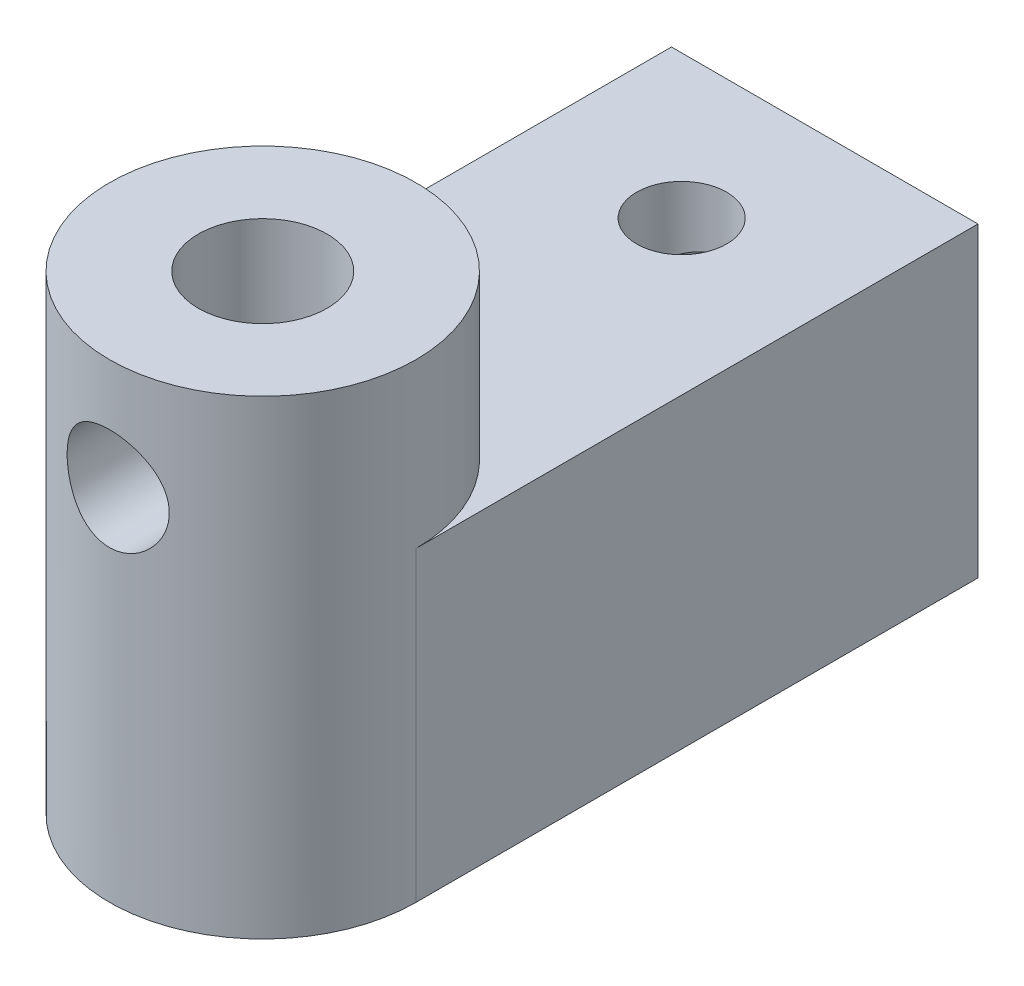
ISO-10303-21;
HEADER;
FILE_DESCRIPTION(('STEP AP214'),'2;1');
FILE_NAME('part.step','',(''),(''),'','','');
FILE_SCHEMA(('AUTOMOTIVE_DESIGN { 1 0 10303 214 1 1 1 1 }'));
ENDSEC;
DATA;
#1=APPLICATION_CONTEXT('core data for automotive mechanical design processes');
#2=APPLICATION_PROTOCOL_DEFINITION('international standard','automotive_design',2000,#1);
#3=PRODUCT_CONTEXT('',#1,'mechanical');
#4=PRODUCT('Part','Part','',(#3));
#5=PRODUCT_RELATED_PRODUCT_CATEGORY('part','',(#4));
#6=PRODUCT_DEFINITION_FORMATION('','',#4);
#7=PRODUCT_DEFINITION_CONTEXT('part definition',#1,'design');
#8=PRODUCT_DEFINITION('design','',#6,#7);
#9=PRODUCT_DEFINITION_SHAPE('','',#8);
#10=(LENGTH_UNIT() NAMED_UNIT(*) SI_UNIT(.MILLI.,.METRE.));
#11=(NAMED_UNIT(*) PLANE_ANGLE_UNIT() SI_UNIT($,.RADIAN.));
#12=(NAMED_UNIT(*) SI_UNIT($,.STERADIAN.) SOLID_ANGLE_UNIT());
#13=UNCERTAINTY_MEASURE_WITH_UNIT(LENGTH_MEASURE(1.E-05),#10,'distance_accuracy_value','');
#14=(GEOMETRIC_REPRESENTATION_CONTEXT(3) GLOBAL_UNCERTAINTY_ASSIGNED_CONTEXT((#13)) GLOBAL_UNIT_ASSIGNED_CONTEXT((#10,
#11,#12)) REPRESENTATION_CONTEXT('',''));
#15=CARTESIAN_POINT('',(0.,0.,0.));
#16=DIRECTION('',(0.,0.,1.));
#17=DIRECTION('',(1.,0.,0.));
#18=AXIS2_PLACEMENT_3D('',#15,#16,#17);
#19=CARTESIAN_POINT('',(0.,13.,0.));
#20=DIRECTION('',(0.,-1.,0.));
#21=DIRECTION('',(0.,0.,-1.));
#22=AXIS2_PLACEMENT_3D('',#19,#20,#21);
#23=CYLINDRICAL_SURFACE('',#22,7.5);
#24=CARTESIAN_POINT('',(0.,13.,0.));
#25=DIRECTION('',(0.,1.,0.));
#26=DIRECTION('',(0.,0.,1.));
#27=AXIS2_PLACEMENT_3D('',#24,#25,#26);
#28=CIRCLE('',#27,7.5);
#29=CARTESIAN_POINT('',(0.,13.,7.5));
#30=VERTEX_POINT('',#29);
#31=EDGE_CURVE('E11',#30,#30,#28,.T.);
#32=ORIENTED_EDGE('',*,*,#31,.F.);
#33=EDGE_LOOP('',(#32));
#34=FACE_BOUND('',#33,.T.);
#35=DIRECTION('',(0.,-1.,0.));
#36=VECTOR('',#35,1.);
#37=CARTESIAN_POINT('',(7.5,5.,0.));
#38=LINE('',#37,#36);
#39=CARTESIAN_POINT('',(7.5,5.,0.));
#40=VERTEX_POINT('',#39);
#41=CARTESIAN_POINT('',(7.5,-10.,0.));
#42=VERTEX_POINT('',#41);
#43=EDGE_CURVE('E101',#40,#42,#38,.T.);
#44=ORIENTED_EDGE('',*,*,#43,.F.);
#45=CARTESIAN_POINT('',(0.,5.,0.));
#46=DIRECTION('',(0.,-1.,0.));
#47=DIRECTION('',(0.,0.,1.));
#48=AXIS2_PLACEMENT_3D('',#45,#46,#47);
#49=CIRCLE('',#48,7.5);
#50=CARTESIAN_POINT('',(-7.5,5.,0.));
#51=VERTEX_POINT('',#50);
#52=EDGE_CURVE('E122',#51,#40,#49,.T.);
#53=ORIENTED_EDGE('',*,*,#52,.F.);
#54=DIRECTION('',(0.,-1.,0.));
#55=VECTOR('',#54,1.);
#56=CARTESIAN_POINT('',(-7.5,5.,0.));
#57=LINE('',#56,#55);
#58=CARTESIAN_POINT('',(-7.5,-10.,0.));
#59=VERTEX_POINT('',#58);
#60=EDGE_CURVE('E133',#51,#59,#57,.T.);
#61=ORIENTED_EDGE('',*,*,#60,.T.);
#62=CARTESIAN_POINT('',(0.,-10.,0.));
#63=DIRECTION('',(0.,-1.,0.));
#64=DIRECTION('',(0.,0.,-1.));
#65=AXIS2_PLACEMENT_3D('',#62,#63,#64);
#66=CIRCLE('',#65,7.5);
#67=EDGE_CURVE('E141',#42,#59,#66,.T.);
#68=ORIENTED_EDGE('',*,*,#67,.F.);
#69=EDGE_LOOP('',(#44,#53,#61,#68));
#70=FACE_BOUND('',#69,.T.);
#71=CARTESIAN_POINT('',(-2.5,7.53727981258729,7.07106781186547));
#72=CARTESIAN_POINT('',(-2.50000064486928,7.67345024967747,7.07106736326085));
#73=CARTESIAN_POINT('',(-2.48883695921381,7.80961681214627,7.07504423227143));
#74=CARTESIAN_POINT('',(-2.44462782922202,8.07791586507291,7.09043935203137));
#75=CARTESIAN_POINT('',(-2.41157878042099,8.21004768726846,7.10185882855472));
#76=CARTESIAN_POINT('',(-2.32488871421226,8.46634704508051,7.13070509221979));
#77=CARTESIAN_POINT('',(-2.27128805350812,8.59052963619408,7.14812009928304));
#78=CARTESIAN_POINT('',(-2.14515407110345,8.82817993395719,7.18697805025812));
#79=CARTESIAN_POINT('',(-2.07261657215046,8.94164526897136,7.20842188259031));
#80=CARTESIAN_POINT('',(-1.9076278661072,9.15907971843307,7.25386223518683));
#81=CARTESIAN_POINT('',(-1.8145608534448,9.26256838426661,7.2779223711161));
#82=CARTESIAN_POINT('',(-1.61246916803599,9.45279681564888,7.32534662002507));
#83=CARTESIAN_POINT('',(-1.50344193763094,9.53953389154321,7.34871062072404));
#84=CARTESIAN_POINT('',(-1.26901126991252,9.69597705591127,7.39284667304497));
#85=CARTESIAN_POINT('',(-1.14325477806131,9.76517973913218,7.41353519254014));
#86=CARTESIAN_POINT('',(-0.881078057468685,9.88125877540606,7.44923966927457));
#87=CARTESIAN_POINT('',(-0.74466071421803,9.92814114552955,7.46425715507505));
#88=CARTESIAN_POINT('',(-0.470072043583737,9.99661944916827,7.48647688579767));
#89=CARTESIAN_POINT('',(-0.332126887132422,10.0190384282298,7.49393286943898));
#90=CARTESIAN_POINT('',(-0.0542446870602243,10.0405705459889,7.5010902054562));
#91=CARTESIAN_POINT('',(0.0856918338597405,10.0396896917183,7.50079355657239));
#92=CARTESIAN_POINT('',(0.357758787984536,10.0151691761722,7.49265099046828));
#93=CARTESIAN_POINT('',(0.489980121479141,9.99242349140107,7.48510161887793));
#94=CARTESIAN_POINT('',(0.748608597055429,9.92629736013611,7.46367418349329));
#95=CARTESIAN_POINT('',(0.87501534444804,9.88291551513773,7.44979569077954));
#96=CARTESIAN_POINT('',(1.12038118710493,9.77622651932214,7.41689175733061));
#97=CARTESIAN_POINT('',(1.23922055242211,9.71266496622101,7.39780106310039));
#98=CARTESIAN_POINT('',(1.46481081381831,9.56763054896565,7.35645982597298));
#99=CARTESIAN_POINT('',(1.57155833596335,9.48615270426821,7.33420840503667));
#100=CARTESIAN_POINT('',(1.77525216637827,9.30309382893804,7.28765479624741));
#101=CARTESIAN_POINT('',(1.87150039266318,9.20074691798358,7.26330537922194));
#102=CARTESIAN_POINT('',(2.04569314899543,8.98115799827074,7.21618338122252));
#103=CARTESIAN_POINT('',(2.12363485820386,8.86391369826718,7.19341104364038));
#104=CARTESIAN_POINT('',(2.25996863758936,8.61564574857869,7.15176312802781));
#105=CARTESIAN_POINT('',(2.31806615905335,8.48444948429285,7.1329477321187));
#106=CARTESIAN_POINT('',(2.41110798317334,8.21335132705124,7.10204127060962));
#107=CARTESIAN_POINT('',(2.44606198936873,8.07345310957167,7.08994738717732));
#108=CARTESIAN_POINT('',(2.4904032052438,7.79568392405835,7.07449090788963));
#109=CARTESIAN_POINT('',(2.50087273876908,7.65800625071565,7.0707590079689));
#110=CARTESIAN_POINT('',(2.4990135972743,7.38283943980202,7.07141680147961));
#111=CARTESIAN_POINT('',(2.48668906306691,7.24535027252732,7.07580501979536));
#112=CARTESIAN_POINT('',(2.44056412888078,6.97938739830751,7.09184045225748));
#113=CARTESIAN_POINT('',(2.40751598495171,6.85076623721018,7.10323313602101));
#114=CARTESIAN_POINT('',(2.32178465640117,6.60092079698933,7.13171384177557));
#115=CARTESIAN_POINT('',(2.26909799090856,6.47969783361034,7.14880287337099));
#116=CARTESIAN_POINT('',(2.14368585184734,6.24382876046979,7.18742193989467));
#117=CARTESIAN_POINT('',(2.07037779589624,6.12951320598278,7.20907564164071));
#118=CARTESIAN_POINT('',(1.9064640763939,5.91441468162799,7.25414421827413));
#119=CARTESIAN_POINT('',(1.81585331374696,5.81363571593424,7.27755961109486));
#120=CARTESIAN_POINT('',(1.61472926475081,5.62345985236069,7.32487596594623));
#121=CARTESIAN_POINT('',(1.50346817636663,5.53484383754016,7.34874608944741));
#122=CARTESIAN_POINT('',(1.26706822850064,5.37748945671718,7.39317129032772));
#123=CARTESIAN_POINT('',(1.14192986216138,5.30875038468123,7.41372648544237));
#124=CARTESIAN_POINT('',(0.881949656080739,5.193729550433,7.44911014526507));
#125=CARTESIAN_POINT('',(0.747177808302991,5.14730161971712,7.46397575011328));
#126=CARTESIAN_POINT('',(0.471146164615041,5.07796045743702,7.48646527094436));
#127=CARTESIAN_POINT('',(0.329888729884724,5.05503873788603,7.49409180085047));
#128=CARTESIAN_POINT('',(0.052038339650103,5.03412461857318,7.50104658090641));
#129=CARTESIAN_POINT('',(-0.0844618098000455,5.03501117775634,7.50074800223598));
#130=CARTESIAN_POINT('',(-0.355277862500434,5.05892308295331,7.49280491298495));
#131=CARTESIAN_POINT('',(-0.489593942047642,5.08194663296921,7.48516099833939));
#132=CARTESIAN_POINT('',(-0.750105298580148,5.14873539902719,7.46352287386031));
#133=CARTESIAN_POINT('',(-0.876395677281973,5.19216535096962,7.44963145902871));
#134=CARTESIAN_POINT('',(-1.11994587734949,5.29822364033017,7.41692901761237));
#135=CARTESIAN_POINT('',(-1.23720406035608,5.36085545057982,7.39811710120041));
#136=CARTESIAN_POINT('',(-1.46408504077196,5.50620359284231,7.35664672069702));
#137=CARTESIAN_POINT('',(-1.57326562889402,5.58957652604139,7.33387181229816));
#138=CARTESIAN_POINT('',(-1.77645256568107,5.77292329047777,7.28732471979699));
#139=CARTESIAN_POINT('',(-1.87045405406148,5.8729024182441,7.26355221932743));
#140=CARTESIAN_POINT('',(-2.0443545220828,6.09130320155466,7.21658199563995));
#141=CARTESIAN_POINT('',(-2.12355741499475,6.21029359002889,7.19344319971577));
#142=CARTESIAN_POINT('',(-2.26078585825279,6.46061587984424,7.15150483307538));
#143=CARTESIAN_POINT('',(-2.31881694204869,6.59194454516145,7.13270412903123));
#144=CARTESIAN_POINT('',(-2.40960957051041,6.85718437262637,7.10253335516286));
#145=CARTESIAN_POINT('',(-2.4433947728738,6.9907104714007,7.09086582142956));
#146=CARTESIAN_POINT('',(-2.48858580037317,7.26191993875404,7.07513458848796));
#147=CARTESIAN_POINT('',(-2.49999934799148,7.39960185611406,7.07106826543653));
#148=CARTESIAN_POINT('',(-2.5,7.53727981258729,7.07106781186547));
#149=B_SPLINE_CURVE_WITH_KNOTS('',3,(#71,#72,#73,#74,#75,#76,#77,#78,#79,#80,#81,#82,#83,#84,
#85,#86,#87,#88,#89,#90,#91,#92,#93,#94,#95,#96,#97,#98,#99,#100,#101,#102,#103,#104,#105,#106,
#107,#108,#109,#110,#111,#112,#113,#114,#115,#116,#117,#118,#119,#120,#121,#122,#123,#124,#125,
#126,#127,#128,#129,#130,#131,#132,#133,#134,#135,#136,#137,#138,#139,#140,#141,#142,#143,#144,
#145,#146,#147,#148),.UNSPECIFIED.,.T.,.F.,(4,2,2,2,2,2,2,2,2,2,2,2,2,2,2,2,2,2,2,2,2,2,2,2,2,2,
2,2,2,2,2,2,2,2,2,2,2,2,4),(0.,0.40800146199839,0.816070137537909,1.22334156875207,
1.63070291546361,2.0525334356892,2.4744316292997,2.90733765359143,3.34012690966973,
3.75785796912336,4.17548133255818,4.57672512063923,4.97799610473092,5.38454137150837,
5.79119979685055,6.21700435909794,6.64287449030265,7.07481599607639,7.50657628391539,
7.91885728411099,8.33106339593084,8.7291098942194,9.12722697867364,9.53797144339287,
9.94883714155318,10.3794702042773,10.8100879689383,11.2378447797713,11.6654470751039,
12.0729521169409,12.4804241002445,12.8814239010107,13.2824962690811,13.6983879880158,
14.1144126108158,14.5467225684036,14.9789194566717,15.3915803040673,15.8040986797616),.UNSPECIFIED.);
#150=CARTESIAN_POINT('',(-2.5,7.53727981258729,7.07106781186547));
#151=VERTEX_POINT('',#150);
#152=EDGE_CURVE('E226',#151,#151,#149,.T.);
#153=ORIENTED_EDGE('',*,*,#152,.T.);
#154=EDGE_LOOP('',(#153));
#155=FACE_BOUND('',#154,.T.);
#156=ADVANCED_FACE('F41',(#34,#70,#155),#23,.T.);
#157=CARTESIAN_POINT('',(0.,13.,0.));
#158=DIRECTION('',(0.,-1.,0.));
#159=DIRECTION('',(0.,0.,-1.));
#160=AXIS2_PLACEMENT_3D('',#157,#158,#159);
#161=CYLINDRICAL_SURFACE('',#160,3.15);
#162=CARTESIAN_POINT('',(0.,0.,0.));
#163=DIRECTION('',(0.,1.,0.));
#164=DIRECTION('',(0.,0.,1.));
#165=AXIS2_PLACEMENT_3D('',#162,#163,#164);
#166=CIRCLE('',#165,3.15);
#167=CARTESIAN_POINT('',(0.,0.,3.15));
#168=VERTEX_POINT('',#167);
#169=EDGE_CURVE('E144',#168,#168,#166,.T.);
#170=ORIENTED_EDGE('',*,*,#169,.F.);
#171=EDGE_LOOP('',(#170));
#172=FACE_BOUND('',#171,.T.);
#173=CARTESIAN_POINT('',(0.,13.,0.));
#174=DIRECTION('',(0.,1.,0.));
#175=DIRECTION('',(0.,0.,1.));
#176=AXIS2_PLACEMENT_3D('',#173,#174,#175);
#177=CIRCLE('',#176,3.15);
#178=CARTESIAN_POINT('',(0.,13.,3.15));
#179=VERTEX_POINT('',#178);
#180=EDGE_CURVE('E56',#179,#179,#177,.T.);
#181=ORIENTED_EDGE('',*,*,#180,.T.);
#182=EDGE_LOOP('',(#181));
#183=FACE_BOUND('',#182,.T.);
#184=CARTESIAN_POINT('',(-2.5,7.53727981258729,1.91637678967368));
#185=CARTESIAN_POINT('',(-2.50000481336088,7.442287640456,1.91636569342069));
#186=CARTESIAN_POINT('',(-2.49453921957506,7.34731714379724,1.9235616215752));
#187=CARTESIAN_POINT('',(-2.47322197837662,7.16036611713374,1.95088654713941));
#188=CARTESIAN_POINT('',(-2.45734724615938,7.06839271092106,1.97104428860632));
#189=CARTESIAN_POINT('',(-2.40932266513046,6.85876775801117,2.02965938227219));
#190=CARTESIAN_POINT('',(-2.37346257465234,6.7430982213983,2.0720182406521));
#191=CARTESIAN_POINT('',(-2.28742245175883,6.52144727582231,2.16663139824787));
#192=CARTESIAN_POINT('',(-2.23720050060087,6.41549544388409,2.21891451148909));
#193=CARTESIAN_POINT('',(-2.14226026198435,6.24623005598039,2.30998834790925));
#194=CARTESIAN_POINT('',(-2.10107540722968,6.1802670914825,2.34762852829518));
#195=CARTESIAN_POINT('',(-2.01297084710013,6.05270434705216,2.42360018390345));
#196=CARTESIAN_POINT('',(-1.96604916991019,5.99110607887405,2.46193189293177));
#197=CARTESIAN_POINT('',(-1.81690499330267,5.81309733553499,2.57623361434105));
#198=CARTESIAN_POINT('',(-1.70615905469512,5.70321660048563,2.65165645168917));
#199=CARTESIAN_POINT('',(-1.48646556014856,5.52321459327068,2.77953805583491));
#200=CARTESIAN_POINT('',(-1.38136459616789,5.44951741782039,2.83360901303536));
#201=CARTESIAN_POINT('',(-1.15770702148479,5.3177094479159,2.93207529450144));
#202=CARTESIAN_POINT('',(-1.03917160979643,5.25957457105576,2.97648554835642));
#203=CARTESIAN_POINT('',(-0.810526647030403,5.16965736169178,3.0458928476986));
#204=CARTESIAN_POINT('',(-0.702091704583694,5.13514997789383,3.07285702024744));
#205=CARTESIAN_POINT('',(-0.479393455575093,5.08100529550272,3.11536508706588));
#206=CARTESIAN_POINT('',(-0.365133327585331,5.06135997803432,3.13091513972536));
#207=CARTESIAN_POINT('',(-0.133565580289274,5.03813185745013,3.14931570850617));
#208=CARTESIAN_POINT('',(-0.0162491023761022,5.03460260094305,3.15212388877292));
#209=CARTESIAN_POINT('',(0.217300092404373,5.04400080948005,3.14466723845068));
#210=CARTESIAN_POINT('',(0.33353274276203,5.05692927785306,3.13440161082991));
#211=CARTESIAN_POINT('',(0.555382886611707,5.09727837410615,3.10257383915971));
#212=CARTESIAN_POINT('',(0.661237716835977,5.12390666910299,3.08162982494591));
#213=CARTESIAN_POINT('',(0.86650226796032,5.18976957746575,3.03032653493511));
#214=CARTESIAN_POINT('',(0.965910377156102,5.22900732875275,2.99996491558934));
#215=CARTESIAN_POINT('',(1.16614638981006,5.32289356309255,2.92830913854913));
#216=CARTESIAN_POINT('',(1.26615830131932,5.37867563636916,2.88623507031245));
#217=CARTESIAN_POINT('',(1.45560803094847,5.50160359116661,2.79548896865547));
#218=CARTESIAN_POINT('',(1.54503950808539,5.56875622918621,2.74681301577417));
#219=CARTESIAN_POINT('',(1.73015816515951,5.72776136921023,2.63496006914718));
#220=CARTESIAN_POINT('',(1.82335880043798,5.82185425866888,2.57085787571947));
#221=CARTESIAN_POINT('',(1.99358153640545,6.02300467957661,2.44122417117006));
#222=CARTESIAN_POINT('',(2.07058508733398,6.13007685684984,2.37569111509931));
#223=CARTESIAN_POINT('',(2.19997020092368,6.34398673797316,2.25599002669514));
#224=CARTESIAN_POINT('',(2.25415085249706,6.44948352492968,2.20137456814705));
#225=CARTESIAN_POINT('',(2.34803882002893,6.67063233254133,2.10093298527824));
#226=CARTESIAN_POINT('',(2.38777788251836,6.78626137615538,2.05508768821311));
#227=CARTESIAN_POINT('',(2.44153330005093,6.99251830981696,1.99064254123793));
#228=CARTESIAN_POINT('',(2.45966019877266,7.08077733104336,1.96799904188137));
#229=CARTESIAN_POINT('',(2.48632400162942,7.26081542644467,1.93421061739557));
#230=CARTESIAN_POINT('',(2.49488124534641,7.35258660447757,1.92304130886766));
#231=CARTESIAN_POINT('',(2.50172069323035,7.53766576149312,1.91414114430065));
#232=CARTESIAN_POINT('',(2.49995114882464,7.63097913970663,1.91647796828561));
#233=CARTESIAN_POINT('',(2.48618851820122,7.81561718352639,1.93428963975207));
#234=CARTESIAN_POINT('',(2.47418044032107,7.90693873141837,1.94978375251709));
#235=CARTESIAN_POINT('',(2.4363715517725,8.10947622050155,1.99692648270543));
#236=CARTESIAN_POINT('',(2.40771418243299,8.2193743030446,2.03181572083994));
#237=CARTESIAN_POINT('',(2.33749397068425,8.43093909733902,2.11221606918778));
#238=CARTESIAN_POINT('',(2.29589334574266,8.53258059750301,2.1577581782233));
#239=CARTESIAN_POINT('',(2.21463902795812,8.69976792766019,2.24058833353436));
#240=CARTESIAN_POINT('',(2.17778098762955,8.76737366988017,2.27655277872926));
#241=CARTESIAN_POINT('',(2.09839677743203,8.89838330906729,2.34992576596565));
#242=CARTESIAN_POINT('',(2.05586843085438,8.9617855783468,2.38733485863905));
#243=CARTESIAN_POINT('',(1.96526721891577,9.0843843984617,2.46245566108453));
#244=CARTESIAN_POINT('',(1.91719113661606,9.14357847663965,2.50016753451744));
#245=CARTESIAN_POINT('',(1.81560002900031,9.25758153408302,2.57489602484883));
#246=CARTESIAN_POINT('',(1.76208222013565,9.31238824324624,2.61191227433586));
#247=CARTESIAN_POINT('',(1.59212413256682,9.4710024601982,2.7213683837043));
#248=CARTESIAN_POINT('',(1.46717337648401,9.56778276415919,2.79143684282292));
#249=CARTESIAN_POINT('',(1.26438648964982,9.69544970609493,2.88607187202518));
#250=CARTESIAN_POINT('',(1.19429439906125,9.73506280674952,2.91585215789373));
#251=CARTESIAN_POINT('',(1.04926863296856,9.80787738925495,2.97111861937727));
#252=CARTESIAN_POINT('',(0.974337763030501,9.84108254272431,2.99660725294453));
#253=CARTESIAN_POINT('',(0.793016180884583,9.91079379916751,3.05047853335277));
#254=CARTESIAN_POINT('',(0.684822182808709,9.94436047647999,3.07673139329912));
#255=CARTESIAN_POINT('',(0.462868555604543,9.99669747806423,3.11784736489806));
#256=CARTESIAN_POINT('',(0.349113191282559,10.0154789572325,3.13271906298861));
#257=CARTESIAN_POINT('',(0.118751445190665,10.037142816564,3.14988411937067));
#258=CARTESIAN_POINT('',(0.00213706223962179,10.0399738041262,3.15213681902217));
#259=CARTESIAN_POINT('',(-0.229883432371584,10.0293962871322,3.14374529489746));
#260=CARTESIAN_POINT('',(-0.345289392250281,10.0159857666991,3.13309947017136));
#261=CARTESIAN_POINT('',(-0.566188335257463,9.97479545689383,3.10061805504065));
#262=CARTESIAN_POINT('',(-0.671893061753026,9.94770622410331,3.07932065130099));
#263=CARTESIAN_POINT('',(-0.876788673240281,9.88096581980565,3.02736297326131));
#264=CARTESIAN_POINT('',(-0.975977893216798,9.8413114522831,2.99670031692631));
#265=CARTESIAN_POINT('',(-1.17594711080402,9.74648782978298,2.92439103625877));
#266=CARTESIAN_POINT('',(-1.27588499432623,9.69015978542062,2.88195018387879));
#267=CARTESIAN_POINT('',(-1.46511263234463,9.56613776003459,2.79052123818953));
#268=CARTESIAN_POINT('',(-1.55439564293534,9.4984366451059,2.74152903942305));
#269=CARTESIAN_POINT('',(-1.7392036644905,9.33813473128859,2.62900249201611));
#270=CARTESIAN_POINT('',(-1.83221304128772,9.24327881403734,2.56455384021115));
#271=CARTESIAN_POINT('',(-2.00191618466813,9.04055691854435,2.43439135419204));
#272=CARTESIAN_POINT('',(-2.07859390546887,8.93267830707165,2.36867634426298));
#273=CARTESIAN_POINT('',(-2.20641644286463,8.71849950892331,2.24963746618314));
#274=CARTESIAN_POINT('',(-2.25955358413295,8.6136828530248,2.19579074564119));
#275=CARTESIAN_POINT('',(-2.3516149935329,8.39404113553677,2.09689191023709));
#276=CARTESIAN_POINT('',(-2.39056048246121,8.27923133785242,2.05182671169326));
#277=CARTESIAN_POINT('',(-2.44671954590184,8.06070786211788,1.98435694262435));
#278=CARTESIAN_POINT('',(-2.46652191587716,7.95849267693926,1.95938531824126));
#279=CARTESIAN_POINT('',(-2.49313769557465,7.74992582555105,1.92542822113524));
#280=CARTESIAN_POINT('',(-2.49999461318072,7.64358924510992,1.91638920792175));
#281=CARTESIAN_POINT('',(-2.5,7.53727981258729,1.91637678967368));
#282=B_SPLINE_CURVE_WITH_KNOTS('',3,(#184,#185,#186,#187,#188,#189,#190,#191,#192,#193,#194,
#195,#196,#197,#198,#199,#200,#201,#202,#203,#204,#205,#206,#207,#208,#209,#210,#211,#212,#213,
#214,#215,#216,#217,#218,#219,#220,#221,#222,#223,#224,#225,#226,#227,#228,#229,#230,#231,#232,
#233,#234,#235,#236,#237,#238,#239,#240,#241,#242,#243,#244,#245,#246,#247,#248,#249,#250,#251,
#252,#253,#254,#255,#256,#257,#258,#259,#260,#261,#262,#263,#264,#265,#266,#267,#268,#269,#270,
#271,#272,#273,#274,#275,#276,#277,#278,#279,#280,#281),.UNSPECIFIED.,.T.,.F.,(4,2,2,2,2,2,2,2,
2,2,2,2,2,2,2,2,2,2,2,2,2,2,2,2,2,2,2,2,2,2,2,2,2,2,2,2,2,2,2,2,2,2,2,2,2,2,2,2,4),(0.,
0.284555358092769,0.569743931316466,0.952515666943966,1.33641622611963,1.59530285322924,
1.85427871427495,2.37125643221051,2.78759647832011,3.20328847082891,3.55263569607782,
3.90179429522037,4.25211215530301,4.60245137319035,4.93448930258713,5.26660992521644,
5.63128602191698,5.99617957802575,6.43600343950848,6.87632830057697,7.26689263501761,
7.65659313402081,7.93426190412943,8.21133938180857,8.48980651088391,8.76868208405721,
9.1231564217772,9.47867536717756,9.73333782068504,9.9880983166229,10.2430072887493,
10.4980473140458,11.0131758450179,11.2703193278177,11.5273150324947,11.8746080200272,
12.2216387357888,12.5697869504235,12.917978381238,13.2501263731972,13.582358916847,
13.947983571297,14.3138384307821,14.7552110042159,15.1970152441381,15.5836770078552,
15.9697581998839,16.2892909936524,16.6077479565936),.UNSPECIFIED.);
#283=CARTESIAN_POINT('',(-2.5,7.53727981258729,1.91637678967368));
#284=VERTEX_POINT('',#283);
#285=EDGE_CURVE('E46',#284,#284,#282,.T.);
#286=ORIENTED_EDGE('',*,*,#285,.T.);
#287=EDGE_LOOP('',(#286));
#288=FACE_BOUND('',#287,.T.);
#289=ADVANCED_FACE('F43',(#172,#183,#288),#161,.F.);
#290=CARTESIAN_POINT('',(0.,13.,0.));
#291=DIRECTION('',(0.,1.,0.));
#292=DIRECTION('',(0.,0.,1.));
#293=AXIS2_PLACEMENT_3D('',#290,#291,#292);
#294=PLANE('',#293);
#295=ORIENTED_EDGE('',*,*,#180,.F.);
#296=EDGE_LOOP('',(#295));
#297=FACE_BOUND('',#296,.T.);
#298=ORIENTED_EDGE('',*,*,#31,.T.);
#299=EDGE_LOOP('',(#298));
#300=FACE_BOUND('',#299,.T.);
#301=ADVANCED_FACE('F192',(#297,#300),#294,.T.);
#302=CARTESIAN_POINT('',(0.,0.,0.));
#303=DIRECTION('',(0.,-1.,0.));
#304=DIRECTION('',(0.,0.,-1.));
#305=AXIS2_PLACEMENT_3D('',#302,#303,#304);
#306=PLANE('',#305);
#307=ORIENTED_EDGE('',*,*,#169,.T.);
#308=EDGE_LOOP('',(#307));
#309=FACE_BOUND('',#308,.T.);
#310=ADVANCED_FACE('F199',(#309),#306,.F.);
#311=CARTESIAN_POINT('',(0.,-10.,0.));
#312=DIRECTION('',(0.,-1.,0.));
#313=DIRECTION('',(0.,0.,-1.));
#314=AXIS2_PLACEMENT_3D('',#311,#312,#313);
#315=PLANE('',#314);
#316=CARTESIAN_POINT('',(0.,-10.,-20.5));
#317=DIRECTION('',(0.,-1.,0.));
#318=DIRECTION('',(0.,0.,-1.));
#319=AXIS2_PLACEMENT_3D('',#316,#317,#318);
#320=CIRCLE('',#319,2.2);
#321=CARTESIAN_POINT('',(0.,-10.,-22.7));
#322=VERTEX_POINT('',#321);
#323=EDGE_CURVE('E160',#322,#322,#320,.T.);
#324=ORIENTED_EDGE('',*,*,#323,.F.);
#325=EDGE_LOOP('',(#324));
#326=FACE_BOUND('',#325,.T.);
#327=ORIENTED_EDGE('',*,*,#67,.T.);
#328=DIRECTION('',(0.,0.,1.));
#329=VECTOR('',#328,1.);
#330=CARTESIAN_POINT('',(-7.5,-10.,0.));
#331=LINE('',#330,#329);
#332=CARTESIAN_POINT('',(-7.5,-10.,-27.5));
#333=VERTEX_POINT('',#332);
#334=EDGE_CURVE('E106',#333,#59,#331,.T.);
#335=ORIENTED_EDGE('',*,*,#334,.F.);
#336=DIRECTION('',(-1.,0.,0.));
#337=VECTOR('',#336,1.);
#338=CARTESIAN_POINT('',(-7.5,-10.,-27.5));
#339=LINE('',#338,#337);
#340=CARTESIAN_POINT('',(7.5,-10.,-27.5));
#341=VERTEX_POINT('',#340);
#342=EDGE_CURVE('E97',#341,#333,#339,.T.);
#343=ORIENTED_EDGE('',*,*,#342,.F.);
#344=DIRECTION('',(0.,0.,-1.));
#345=VECTOR('',#344,1.);
#346=CARTESIAN_POINT('',(7.5,-10.,0.));
#347=LINE('',#346,#345);
#348=EDGE_CURVE('E64',#42,#341,#347,.T.);
#349=ORIENTED_EDGE('',*,*,#348,.F.);
#350=EDGE_LOOP('',(#327,#335,#343,#349));
#351=FACE_BOUND('',#350,.T.);
#352=ADVANCED_FACE('F105',(#326,#351),#315,.T.);
#353=CARTESIAN_POINT('',(7.5,5.,0.));
#354=DIRECTION('',(-1.,0.,0.));
#355=DIRECTION('',(0.,0.,1.));
#356=AXIS2_PLACEMENT_3D('',#353,#354,#355);
#357=PLANE('',#356);
#358=ORIENTED_EDGE('',*,*,#43,.T.);
#359=ORIENTED_EDGE('',*,*,#348,.T.);
#360=DIRECTION('',(0.,-1.,0.));
#361=VECTOR('',#360,1.);
#362=CARTESIAN_POINT('',(7.5,5.,-27.5));
#363=LINE('',#362,#361);
#364=CARTESIAN_POINT('',(7.5,5.,-27.5));
#365=VERTEX_POINT('',#364);
#366=EDGE_CURVE('E94',#365,#341,#363,.T.);
#367=ORIENTED_EDGE('',*,*,#366,.F.);
#368=DIRECTION('',(0.,0.,-1.));
#369=VECTOR('',#368,1.);
#370=CARTESIAN_POINT('',(7.5,5.,0.));
#371=LINE('',#370,#369);
#372=EDGE_CURVE('E126',#40,#365,#371,.T.);
#373=ORIENTED_EDGE('',*,*,#372,.F.);
#374=EDGE_LOOP('',(#358,#359,#367,#373));
#375=FACE_BOUND('',#374,.T.);
#376=ADVANCED_FACE('F109',(#375),#357,.F.);
#377=CARTESIAN_POINT('',(-7.5,5.,-27.5));
#378=DIRECTION('',(0.,0.,1.));
#379=DIRECTION('',(1.,0.,0.));
#380=AXIS2_PLACEMENT_3D('',#377,#378,#379);
#381=PLANE('',#380);
#382=CARTESIAN_POINT('',(0.,-2.5,-27.5));
#383=DIRECTION('',(0.,0.,-1.));
#384=DIRECTION('',(-1.,0.,0.));
#385=AXIS2_PLACEMENT_3D('',#382,#383,#384);
#386=CIRCLE('',#385,4.7);
#387=CARTESIAN_POINT('',(-4.7,-2.5,-27.5));
#388=VERTEX_POINT('',#387);
#389=EDGE_CURVE('E117',#388,#388,#386,.T.);
#390=ORIENTED_EDGE('',*,*,#389,.F.);
#391=EDGE_LOOP('',(#390));
#392=FACE_BOUND('',#391,.T.);
#393=ORIENTED_EDGE('',*,*,#366,.T.);
#394=ORIENTED_EDGE('',*,*,#342,.T.);
#395=DIRECTION('',(0.,-1.,0.));
#396=VECTOR('',#395,1.);
#397=CARTESIAN_POINT('',(-7.5,5.,-27.5));
#398=LINE('',#397,#396);
#399=CARTESIAN_POINT('',(-7.5,5.,-27.5));
#400=VERTEX_POINT('',#399);
#401=EDGE_CURVE('E102',#400,#333,#398,.T.);
#402=ORIENTED_EDGE('',*,*,#401,.F.);
#403=DIRECTION('',(-1.,0.,0.));
#404=VECTOR('',#403,1.);
#405=CARTESIAN_POINT('',(-7.5,5.,-27.5));
#406=LINE('',#405,#404);
#407=EDGE_CURVE('E98',#365,#400,#406,.T.);
#408=ORIENTED_EDGE('',*,*,#407,.F.);
#409=EDGE_LOOP('',(#393,#394,#402,#408));
#410=FACE_BOUND('',#409,.T.);
#411=ADVANCED_FACE('F95',(#392,#410),#381,.F.);
#412=CARTESIAN_POINT('',(-7.5,5.,0.));
#413=DIRECTION('',(1.,0.,0.));
#414=DIRECTION('',(0.,0.,-1.));
#415=AXIS2_PLACEMENT_3D('',#412,#413,#414);
#416=PLANE('',#415);
#417=ORIENTED_EDGE('',*,*,#401,.T.);
#418=ORIENTED_EDGE('',*,*,#334,.T.);
#419=ORIENTED_EDGE('',*,*,#60,.F.);
#420=DIRECTION('',(0.,0.,1.));
#421=VECTOR('',#420,1.);
#422=CARTESIAN_POINT('',(-7.5,5.,0.));
#423=LINE('',#422,#421);
#424=EDGE_CURVE('E72',#400,#51,#423,.T.);
#425=ORIENTED_EDGE('',*,*,#424,.F.);
#426=EDGE_LOOP('',(#417,#418,#419,#425));
#427=FACE_BOUND('',#426,.T.);
#428=ADVANCED_FACE('F211',(#427),#416,.F.);
#429=CARTESIAN_POINT('',(0.,5.,0.));
#430=DIRECTION('',(0.,1.,0.));
#431=DIRECTION('',(0.,0.,1.));
#432=AXIS2_PLACEMENT_3D('',#429,#430,#431);
#433=PLANE('',#432);
#434=CARTESIAN_POINT('',(0.,5.,-20.5));
#435=DIRECTION('',(0.,1.,0.));
#436=DIRECTION('',(0.,0.,1.));
#437=AXIS2_PLACEMENT_3D('',#434,#435,#436);
#438=CIRCLE('',#437,2.2);
#439=CARTESIAN_POINT('',(0.,5.,-18.3));
#440=VERTEX_POINT('',#439);
#441=EDGE_CURVE('E221',#440,#440,#438,.T.);
#442=ORIENTED_EDGE('',*,*,#441,.F.);
#443=EDGE_LOOP('',(#442));
#444=FACE_BOUND('',#443,.T.);
#445=ORIENTED_EDGE('',*,*,#52,.T.);
#446=ORIENTED_EDGE('',*,*,#372,.T.);
#447=ORIENTED_EDGE('',*,*,#407,.T.);
#448=ORIENTED_EDGE('',*,*,#424,.T.);
#449=EDGE_LOOP('',(#445,#446,#447,#448));
#450=FACE_BOUND('',#449,.T.);
#451=ADVANCED_FACE('F185',(#444,#450),#433,.T.);
#452=CARTESIAN_POINT('',(0.,-2.5,-7.5000000000001));
#453=DIRECTION('',(0.,0.,-1.));
#454=DIRECTION('',(-1.,0.,0.));
#455=AXIS2_PLACEMENT_3D('',#452,#453,#454);
#456=CYLINDRICAL_SURFACE('',#455,4.7);
#457=CARTESIAN_POINT('',(0.,2.2,-22.7));
#458=CARTESIAN_POINT('',(-0.11652470877591,2.1999946049169,-22.6999935851695));
#459=CARTESIAN_POINT('',(-0.233213919695943,2.19561892054238,-22.6906877217298));
#460=CARTESIAN_POINT('',(-0.463197921185049,2.17854828521208,-22.653850314947));
#461=CARTESIAN_POINT('',(-0.576484659495455,2.16583501108969,-22.6262786282206));
#462=CARTESIAN_POINT('',(-0.795976745019553,2.13343108100349,-22.5541938206452));
#463=CARTESIAN_POINT('',(-0.90220667097529,2.11376633441756,-22.5097435642152));
#464=CARTESIAN_POINT('',(-1.1055693877353,2.06930696887016,-22.4054620873301));
#465=CARTESIAN_POINT('',(-1.20270366531018,2.04451319043171,-22.3456333866373));
#466=CARTESIAN_POINT('',(-1.39112927957095,1.99053292390581,-22.2085288959317));
#467=CARTESIAN_POINT('',(-1.48180607367589,1.96117990355349,-22.1304749255867));
#468=CARTESIAN_POINT('',(-1.64933488240709,1.90199990585091,-21.9607960636997));
#469=CARTESIAN_POINT('',(-1.72617773764136,1.87217262861446,-21.8691622536589));
#470=CARTESIAN_POINT('',(-1.86889412525886,1.8131876488483,-21.6676702247743));
#471=CARTESIAN_POINT('',(-1.93371492896799,1.78420276336269,-21.5570100951857));
#472=CARTESIAN_POINT('',(-2.04355442437833,1.73291696426895,-21.3248316951457));
#473=CARTESIAN_POINT('',(-2.08858582507517,1.71061176382674,-21.2033204539258));
#474=CARTESIAN_POINT('',(-2.15487489853755,1.6770603565513,-20.9599056367874));
#475=CARTESIAN_POINT('',(-2.17732326655879,1.66526452782312,-20.8384055283004));
#476=CARTESIAN_POINT('',(-2.20149283498856,1.65254585202791,-20.5928363888368));
#477=CARTESIAN_POINT('',(-2.20323035651612,1.65161444330044,-20.4687694578895));
#478=CARTESIAN_POINT('',(-2.18681015237596,1.66027773501195,-20.2350952809864));
#479=CARTESIAN_POINT('',(-2.17065506052397,1.6688130138989,-20.1252991862799));
#480=CARTESIAN_POINT('',(-2.12233352604083,1.69361779446057,-19.9102066467026));
#481=CARTESIAN_POINT('',(-2.09016293221371,1.7098893013057,-19.8049113761268));
#482=CARTESIAN_POINT('',(-2.01009467986403,1.74870915695972,-19.5988761419052));
#483=CARTESIAN_POINT('',(-1.96185105880324,1.7713937537335,-19.4982974826009));
#484=CARTESIAN_POINT('',(-1.85126047978407,1.82047335359177,-19.3062115917784));
#485=CARTESIAN_POINT('',(-1.7889073470647,1.84686997925518,-19.2147083572411));
#486=CARTESIAN_POINT('',(-1.64389832982097,1.90389615741209,-19.0328400693198));
#487=CARTESIAN_POINT('',(-1.55976816570255,1.93467300106277,-18.9436928464996));
#488=CARTESIAN_POINT('',(-1.37754377303631,1.99461580472123,-18.7803037075986));
#489=CARTESIAN_POINT('',(-1.27944439555932,2.02378116522402,-18.706067311947));
#490=CARTESIAN_POINT('',(-1.06753093244193,2.07851088034709,-18.5721420477154));
#491=CARTESIAN_POINT('',(-0.953277957384744,2.10390760481786,-18.5130737830722));
#492=CARTESIAN_POINT('',(-0.714963002342457,2.14687464111823,-18.4154434231234));
#493=CARTESIAN_POINT('',(-0.590907950617723,2.16445042366018,-18.3768669902059));
#494=CARTESIAN_POINT('',(-0.346570037381193,2.18868950938429,-18.3241528235107));
#495=CARTESIAN_POINT('',(-0.226710230373995,2.19607691018752,-18.3083889802279));
#496=CARTESIAN_POINT('',(0.0141640414106511,2.20151981099424,-18.2967476397543));
#497=CARTESIAN_POINT('',(0.135178035713988,2.19957896371107,-18.3008623586091));
#498=CARTESIAN_POINT('',(0.366470211187337,2.18702892727429,-18.3278209164029));
#499=CARTESIAN_POINT('',(0.476930038738203,2.17699992837692,-18.3494115187206));
#500=CARTESIAN_POINT('',(0.692477545310978,2.14997631823843,-18.4088334313478));
#501=CARTESIAN_POINT('',(0.797564595454064,2.13298089367322,-18.4466666379916));
#502=CARTESIAN_POINT('',(1.0030598592457,2.0929478975334,-18.5386399206538));
#503=CARTESIAN_POINT('',(1.10322662967466,2.06974140795236,-18.5932433995414));
#504=CARTESIAN_POINT('',(1.2933301675869,2.01962136021313,-18.7167002961753));
#505=CARTESIAN_POINT('',(1.38326241377209,1.99270617518582,-18.7855599742929));
#506=CARTESIAN_POINT('',(1.55873448219749,1.93504354751446,-18.9426281329717));
#507=CARTESIAN_POINT('',(1.64318590443534,1.90416754208085,-19.0320079934284));
#508=CARTESIAN_POINT('',(1.79631042345624,1.84396740471692,-19.2239320550342));
#509=CARTESIAN_POINT('',(1.86497585359181,1.81464403213902,-19.3264826151597));
#510=CARTESIAN_POINT('',(1.98661974806271,1.76004062087729,-19.5462592418761));
#511=CARTESIAN_POINT('',(2.03900484168108,1.73492621866499,-19.6638582837818));
#512=CARTESIAN_POINT('',(2.12269640492955,1.69361117809459,-19.9077710278621));
#513=CARTESIAN_POINT('',(2.15402636765298,1.6774006086374,-20.0340748431963));
#514=CARTESIAN_POINT('',(2.19212172860951,1.65752594814418,-20.2795329940983));
#515=CARTESIAN_POINT('',(2.2008527098675,1.65285963231231,-20.398300653997));
#516=CARTESIAN_POINT('',(2.19901648101808,1.65383351839827,-20.6356273537307));
#517=CARTESIAN_POINT('',(2.18845478963042,1.65947077295298,-20.7541864435174));
#518=CARTESIAN_POINT('',(2.1501071716079,1.67940726804931,-20.9785841899979));
#519=CARTESIAN_POINT('',(2.12364939467787,1.69303681514404,-21.0847160225258));
#520=CARTESIAN_POINT('',(2.05575915419007,1.72673421371828,-21.2909816863121));
#521=CARTESIAN_POINT('',(2.0143222195879,1.74680398730361,-21.3911137163094));
#522=CARTESIAN_POINT('',(1.91452870775634,1.79275931293951,-21.5898410799478));
#523=CARTESIAN_POINT('',(1.85523204861938,1.81894235580486,-21.6878937929639));
#524=CARTESIAN_POINT('',(1.72254403513758,1.8735554607962,-21.8732618651513));
#525=CARTESIAN_POINT('',(1.64914606029878,1.90198657467571,-21.9605721490975));
#526=CARTESIAN_POINT('',(1.48158750191749,1.96134114941712,-22.131132695765));
#527=CARTESIAN_POINT('',(1.38607739166704,1.99222563171037,-22.2130777112074));
#528=CARTESIAN_POINT('',(1.18165719980014,2.05027065364359,-22.3599796715604));
#529=CARTESIAN_POINT('',(1.0727407556582,2.07742941205929,-22.4249285041718));
#530=CARTESIAN_POINT('',(0.84470269644074,2.12492957633664,-22.5353001474432));
#531=CARTESIAN_POINT('',(0.725633707343783,2.14530373837362,-22.5808170855014));
#532=CARTESIAN_POINT('',(0.480490166901105,2.17699564310342,-22.6506443239704));
#533=CARTESIAN_POINT('',(0.354437626803823,2.18834028249196,-22.6750176256507));
#534=CARTESIAN_POINT('',(0.189479635863532,2.19633297664795,-22.6921556641757));
#535=CARTESIAN_POINT('',(0.151662104845859,2.19770532394648,-22.695094054599));
#536=CARTESIAN_POINT('',(0.0759022034377201,2.19953972370353,-22.6990172873648));
#537=CARTESIAN_POINT('',(0.0379598305088379,2.2000017575366,-22.700002089736));
#538=CARTESIAN_POINT('',(0.,2.2,-22.7));
#539=B_SPLINE_CURVE_WITH_KNOTS('',3,(#457,#458,#459,#460,#461,#462,#463,#464,#465,#466,#467,
#468,#469,#470,#471,#472,#473,#474,#475,#476,#477,#478,#479,#480,#481,#482,#483,#484,#485,#486,
#487,#488,#489,#490,#491,#492,#493,#494,#495,#496,#497,#498,#499,#500,#501,#502,#503,#504,#505,
#506,#507,#508,#509,#510,#511,#512,#513,#514,#515,#516,#517,#518,#519,#520,#521,#522,#523,#524,
#525,#526,#527,#528,#529,#530,#531,#532,#533,#534,#535,#536,#537,#538),.UNSPECIFIED.,.T.,.F.,(4,
2,2,2,2,2,2,2,2,2,2,2,2,2,2,2,2,2,2,2,2,2,2,2,2,2,2,2,2,2,2,2,2,2,2,2,2,2,2,2,4),(0.,
0.349419028123845,0.699608544506507,1.04850636999725,1.3973470648867,1.76536026810323,
2.13361624229435,2.52607279985826,2.91827694739696,3.28850541280667,3.65844210150362,
3.99080813252181,4.32326035724497,4.66338835071168,5.00366548363094,5.38113949239129,
5.75875299663341,6.14997354280904,6.54092000020204,6.90233145174262,7.26360139494893,
7.60104268758972,7.9385233874319,8.2863270933474,8.63428385664127,9.01295416756174,
9.39180799736268,9.78318131802381,10.1741172201882,10.5296922472502,10.8851655770682,
11.2144148632036,11.5437625063596,11.89495897362,12.2463207305107,12.6332433706134,
13.0203503539136,13.4055603221598,13.7896185061798,13.9034451430046,14.0172741087534),.UNSPECIFIED.);
#540=CARTESIAN_POINT('',(0.,2.2,-22.7));
#541=VERTEX_POINT('',#540);
#542=EDGE_CURVE('E159',#541,#541,#539,.T.);
#543=ORIENTED_EDGE('',*,*,#542,.T.);
#544=EDGE_LOOP('',(#543));
#545=FACE_BOUND('',#544,.T.);
#546=CARTESIAN_POINT('',(0.,-7.2,-22.7));
#547=CARTESIAN_POINT('',(0.11652470877591,-7.19999460491691,-22.6999935851695));
#548=CARTESIAN_POINT('',(0.233213919695943,-7.19561892054238,-22.6906877217298));
#549=CARTESIAN_POINT('',(0.463197921185049,-7.17854828521208,-22.653850314947));
#550=CARTESIAN_POINT('',(0.576484659495455,-7.16583501108969,-22.6262786282206));
#551=CARTESIAN_POINT('',(0.795976745019553,-7.13343108100349,-22.5541938206452));
#552=CARTESIAN_POINT('',(0.90220667097529,-7.11376633441756,-22.5097435642152));
#553=CARTESIAN_POINT('',(1.1055693877353,-7.06930696887016,-22.4054620873301));
#554=CARTESIAN_POINT('',(1.20270366531018,-7.04451319043171,-22.3456333866373));
#555=CARTESIAN_POINT('',(1.39112927957095,-6.99053292390581,-22.2085288959317));
#556=CARTESIAN_POINT('',(1.48180607367589,-6.96117990355349,-22.1304749255867));
#557=CARTESIAN_POINT('',(1.64933488240709,-6.90199990585091,-21.9607960636997));
#558=CARTESIAN_POINT('',(1.72617773764136,-6.87217262861446,-21.8691622536589));
#559=CARTESIAN_POINT('',(1.86889412525886,-6.8131876488483,-21.6676702247743));
#560=CARTESIAN_POINT('',(1.93371492896799,-6.78420276336269,-21.5570100951857));
#561=CARTESIAN_POINT('',(2.04355442437833,-6.73291696426895,-21.3248316951457));
#562=CARTESIAN_POINT('',(2.08858582507517,-6.71061176382674,-21.2033204539258));
#563=CARTESIAN_POINT('',(2.15487489853755,-6.6770603565513,-20.9599056367874));
#564=CARTESIAN_POINT('',(2.17732326655879,-6.66526452782312,-20.8384055283004));
#565=CARTESIAN_POINT('',(2.20149283498856,-6.65254585202791,-20.5928363888368));
#566=CARTESIAN_POINT('',(2.20323035651612,-6.65161444330044,-20.4687694578895));
#567=CARTESIAN_POINT('',(2.18681015237596,-6.66027773501195,-20.2350952809864));
#568=CARTESIAN_POINT('',(2.17065506052397,-6.6688130138989,-20.1252991862799));
#569=CARTESIAN_POINT('',(2.12233352604083,-6.69361779446058,-19.9102066467026));
#570=CARTESIAN_POINT('',(2.09016293221371,-6.7098893013057,-19.8049113761268));
#571=CARTESIAN_POINT('',(2.01009467986403,-6.74870915695972,-19.5988761419052));
#572=CARTESIAN_POINT('',(1.96185105880324,-6.7713937537335,-19.4982974826009));
#573=CARTESIAN_POINT('',(1.85126047978407,-6.82047335359177,-19.3062115917784));
#574=CARTESIAN_POINT('',(1.7889073470647,-6.84686997925518,-19.2147083572411));
#575=CARTESIAN_POINT('',(1.64389832982097,-6.90389615741209,-19.0328400693198));
#576=CARTESIAN_POINT('',(1.55976816570255,-6.93467300106277,-18.9436928464996));
#577=CARTESIAN_POINT('',(1.37754377303631,-6.99461580472123,-18.7803037075986));
#578=CARTESIAN_POINT('',(1.27944439555932,-7.02378116522402,-18.706067311947));
#579=CARTESIAN_POINT('',(1.06753093244193,-7.07851088034709,-18.5721420477154));
#580=CARTESIAN_POINT('',(0.953277957384744,-7.10390760481786,-18.5130737830722));
#581=CARTESIAN_POINT('',(0.714963002342457,-7.14687464111823,-18.4154434231234));
#582=CARTESIAN_POINT('',(0.590907950617723,-7.16445042366018,-18.3768669902059));
#583=CARTESIAN_POINT('',(0.346570037381193,-7.1886895093843,-18.3241528235107));
#584=CARTESIAN_POINT('',(0.226710230373996,-7.19607691018752,-18.3083889802279));
#585=CARTESIAN_POINT('',(-0.0141640414106512,-7.20151981099424,-18.2967476397543));
#586=CARTESIAN_POINT('',(-0.135178035713988,-7.19957896371108,-18.3008623586091));
#587=CARTESIAN_POINT('',(-0.366470211187337,-7.18702892727429,-18.3278209164029));
#588=CARTESIAN_POINT('',(-0.476930038738203,-7.17699992837692,-18.3494115187206));
#589=CARTESIAN_POINT('',(-0.692477545310977,-7.14997631823843,-18.4088334313478));
#590=CARTESIAN_POINT('',(-0.797564595454064,-7.13298089367322,-18.4466666379916));
#591=CARTESIAN_POINT('',(-1.0030598592457,-7.0929478975334,-18.5386399206538));
#592=CARTESIAN_POINT('',(-1.10322662967466,-7.06974140795236,-18.5932433995415));
#593=CARTESIAN_POINT('',(-1.2933301675869,-7.01962136021313,-18.7167002961753));
#594=CARTESIAN_POINT('',(-1.38326241377209,-6.99270617518582,-18.7855599742929));
#595=CARTESIAN_POINT('',(-1.55873448219749,-6.93504354751446,-18.9426281329717));
#596=CARTESIAN_POINT('',(-1.64318590443534,-6.90416754208085,-19.0320079934284));
#597=CARTESIAN_POINT('',(-1.79631042345624,-6.84396740471692,-19.2239320550342));
#598=CARTESIAN_POINT('',(-1.86497585359181,-6.81464403213902,-19.3264826151597));
#599=CARTESIAN_POINT('',(-1.98661974806271,-6.76004062087729,-19.5462592418761));
#600=CARTESIAN_POINT('',(-2.03900484168108,-6.73492621866499,-19.6638582837818));
#601=CARTESIAN_POINT('',(-2.12269640492955,-6.69361117809459,-19.9077710278621));
#602=CARTESIAN_POINT('',(-2.15402636765298,-6.6774006086374,-20.0340748431963));
#603=CARTESIAN_POINT('',(-2.19212172860951,-6.65752594814418,-20.2795329940983));
#604=CARTESIAN_POINT('',(-2.2008527098675,-6.65285963231231,-20.398300653997));
#605=CARTESIAN_POINT('',(-2.19901648101808,-6.65383351839827,-20.6356273537307));
#606=CARTESIAN_POINT('',(-2.18845478963042,-6.65947077295298,-20.7541864435174));
#607=CARTESIAN_POINT('',(-2.1501071716079,-6.67940726804931,-20.9785841899979));
#608=CARTESIAN_POINT('',(-2.12364939467787,-6.69303681514404,-21.0847160225258));
#609=CARTESIAN_POINT('',(-2.05575915419007,-6.72673421371828,-21.2909816863121));
#610=CARTESIAN_POINT('',(-2.0143222195879,-6.74680398730361,-21.3911137163094));
#611=CARTESIAN_POINT('',(-1.91452870775634,-6.79275931293951,-21.5898410799478));
#612=CARTESIAN_POINT('',(-1.85523204861938,-6.81894235580486,-21.6878937929639));
#613=CARTESIAN_POINT('',(-1.72254403513758,-6.8735554607962,-21.8732618651513));
#614=CARTESIAN_POINT('',(-1.64914606029878,-6.90198657467571,-21.9605721490975));
#615=CARTESIAN_POINT('',(-1.48158750191749,-6.96134114941713,-22.131132695765));
#616=CARTESIAN_POINT('',(-1.38607739166704,-6.99222563171037,-22.2130777112074));
#617=CARTESIAN_POINT('',(-1.18165719980014,-7.05027065364359,-22.3599796715604));
#618=CARTESIAN_POINT('',(-1.0727407556582,-7.07742941205929,-22.4249285041718));
#619=CARTESIAN_POINT('',(-0.844702696440739,-7.12492957633664,-22.5353001474432));
#620=CARTESIAN_POINT('',(-0.72563370734378,-7.14530373837362,-22.5808170855014));
#621=CARTESIAN_POINT('',(-0.480490166901103,-7.17699564310342,-22.6506443239704));
#622=CARTESIAN_POINT('',(-0.354437626803821,-7.18834028249196,-22.6750176256507));
#623=CARTESIAN_POINT('',(-0.189479635863532,-7.19633297664795,-22.6921556641757));
#624=CARTESIAN_POINT('',(-0.15166210484586,-7.19770532394648,-22.695094054599));
#625=CARTESIAN_POINT('',(-0.0759022034377206,-7.19953972370353,-22.6990172873648));
#626=CARTESIAN_POINT('',(-0.0379598305088381,-7.2000017575366,-22.700002089736));
#627=CARTESIAN_POINT('',(0.,-7.2,-22.7));
#628=B_SPLINE_CURVE_WITH_KNOTS('',3,(#546,#547,#548,#549,#550,#551,#552,#553,#554,#555,#556,
#557,#558,#559,#560,#561,#562,#563,#564,#565,#566,#567,#568,#569,#570,#571,#572,#573,#574,#575,
#576,#577,#578,#579,#580,#581,#582,#583,#584,#585,#586,#587,#588,#589,#590,#591,#592,#593,#594,
#595,#596,#597,#598,#599,#600,#601,#602,#603,#604,#605,#606,#607,#608,#609,#610,#611,#612,#613,
#614,#615,#616,#617,#618,#619,#620,#621,#622,#623,#624,#625,#626,#627),.UNSPECIFIED.,.T.,.F.,(4,
2,2,2,2,2,2,2,2,2,2,2,2,2,2,2,2,2,2,2,2,2,2,2,2,2,2,2,2,2,2,2,2,2,2,2,2,2,2,2,4),(0.,
0.349419028123845,0.699608544506507,1.04850636999725,1.3973470648867,1.76536026810323,
2.13361624229435,2.52607279985826,2.91827694739696,3.28850541280667,3.65844210150362,
3.99080813252181,4.32326035724497,4.66338835071168,5.00366548363094,5.38113949239129,
5.75875299663341,6.14997354280904,6.54092000020204,6.90233145174262,7.26360139494893,
7.60104268758972,7.9385233874319,8.2863270933474,8.63428385664127,9.01295416756174,
9.39180799736268,9.78318131802381,10.1741172201882,10.5296922472502,10.8851655770682,
11.2144148632036,11.5437625063596,11.89495897362,12.2463207305107,12.6332433706134,
13.0203503539136,13.4055603221598,13.7896185061798,13.9034451430046,14.0172741087534),.UNSPECIFIED.);
#629=CARTESIAN_POINT('',(0.,-7.2,-22.7));
#630=VERTEX_POINT('',#629);
#631=EDGE_CURVE('E151',#630,#630,#628,.T.);
#632=ORIENTED_EDGE('',*,*,#631,.T.);
#633=EDGE_LOOP('',(#632));
#634=FACE_BOUND('',#633,.T.);
#635=CARTESIAN_POINT('',(0.,-2.5,-7.5000000000001));
#636=DIRECTION('',(0.,0.,-1.));
#637=DIRECTION('',(-1.,0.,0.));
#638=AXIS2_PLACEMENT_3D('',#635,#636,#637);
#639=CIRCLE('',#638,4.7);
#640=CARTESIAN_POINT('',(-4.7,-2.5,-7.5000000000001));
#641=VERTEX_POINT('',#640);
#642=EDGE_CURVE('E113',#641,#641,#639,.T.);
#643=ORIENTED_EDGE('',*,*,#642,.F.);
#644=EDGE_LOOP('',(#643));
#645=FACE_BOUND('',#644,.T.);
#646=ORIENTED_EDGE('',*,*,#389,.T.);
#647=EDGE_LOOP('',(#646));
#648=FACE_BOUND('',#647,.T.);
#649=ADVANCED_FACE('F164',(#545,#634,#645,#648),#456,.F.);
#650=CARTESIAN_POINT('',(0.,-2.5,-7.5000000000001));
#651=DIRECTION('',(0.,0.,-1.));
#652=DIRECTION('',(-1.,0.,0.));
#653=AXIS2_PLACEMENT_3D('',#650,#651,#652);
#654=PLANE('',#653);
#655=ORIENTED_EDGE('',*,*,#642,.T.);
#656=EDGE_LOOP('',(#655));
#657=FACE_BOUND('',#656,.T.);
#658=ADVANCED_FACE('F176',(#657),#654,.T.);
#659=CARTESIAN_POINT('',(0.,13.,-20.5));
#660=DIRECTION('',(0.,-1.,0.));
#661=DIRECTION('',(0.,0.,-1.));
#662=AXIS2_PLACEMENT_3D('',#659,#660,#661);
#663=CYLINDRICAL_SURFACE('',#662,2.2);
#664=ORIENTED_EDGE('',*,*,#323,.T.);
#665=EDGE_LOOP('',(#664));
#666=FACE_BOUND('',#665,.T.);
#667=ORIENTED_EDGE('',*,*,#631,.F.);
#668=EDGE_LOOP('',(#667));
#669=FACE_BOUND('',#668,.T.);
#670=ADVANCED_FACE('F173',(#666,#669),#663,.F.);
#671=ORIENTED_EDGE('',*,*,#441,.T.);
#672=EDGE_LOOP('',(#671));
#673=FACE_BOUND('',#672,.T.);
#674=ORIENTED_EDGE('',*,*,#542,.F.);
#675=EDGE_LOOP('',(#674));
#676=FACE_BOUND('',#675,.T.);
#677=ADVANCED_FACE('F168',(#673,#676),#663,.F.);
#678=CARTESIAN_POINT('',(0.,7.53727981258729,7.501));
#679=DIRECTION('',(0.,0.,-1.));
#680=DIRECTION('',(-1.,0.,0.));
#681=AXIS2_PLACEMENT_3D('',#678,#679,#680);
#682=CYLINDRICAL_SURFACE('',#681,2.5);
#683=ORIENTED_EDGE('',*,*,#285,.F.);
#684=EDGE_LOOP('',(#683));
#685=FACE_BOUND('',#684,.T.);
#686=ORIENTED_EDGE('',*,*,#152,.F.);
#687=EDGE_LOOP('',(#686));
#688=FACE_BOUND('',#687,.T.);
#689=ADVANCED_FACE('F172',(#685,#688),#682,.F.);
#690=CLOSED_SHELL('',(#156,#289,#301,#310,#352,#376,#411,#428,#451,#649,#658,#670,#677,#689));
#691=MANIFOLD_SOLID_BREP('B2',#690);
#692=ADVANCED_BREP_SHAPE_REPRESENTATION('',(#18,#691),#14);
#693=SHAPE_DEFINITION_REPRESENTATION(#9,#692);
ENDSEC;
END-ISO-10303-21;
